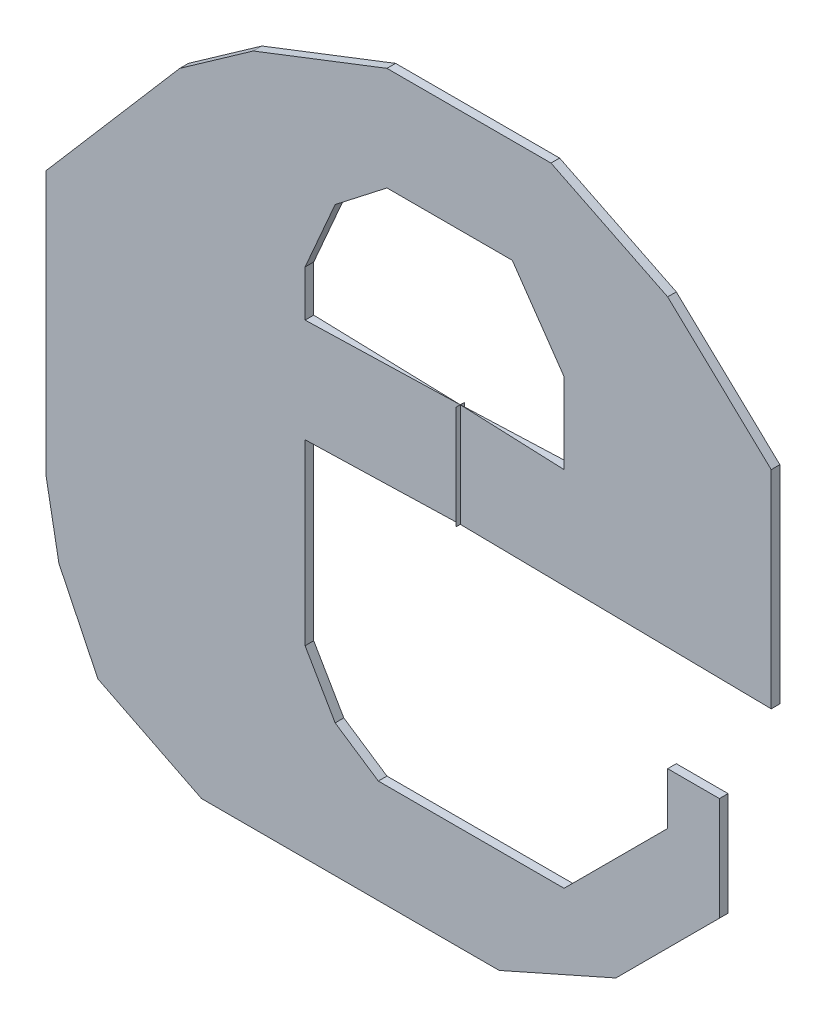
ISO-10303-21;
HEADER;
FILE_DESCRIPTION(('STEP AP214'),'2;1');
FILE_NAME('part.step','',(''),(''),'','','');
FILE_SCHEMA(('AUTOMOTIVE_DESIGN { 1 0 10303 214 1 1 1 1 }'));
ENDSEC;
DATA;
#1=APPLICATION_CONTEXT('core data for automotive mechanical design processes');
#2=APPLICATION_PROTOCOL_DEFINITION('international standard','automotive_design',2000,#1);
#3=PRODUCT_CONTEXT('',#1,'mechanical');
#4=PRODUCT('Part','Part','',(#3));
#5=PRODUCT_RELATED_PRODUCT_CATEGORY('part','',(#4));
#6=PRODUCT_DEFINITION_FORMATION('','',#4);
#7=PRODUCT_DEFINITION_CONTEXT('part definition',#1,'design');
#8=PRODUCT_DEFINITION('design','',#6,#7);
#9=PRODUCT_DEFINITION_SHAPE('','',#8);
#10=(LENGTH_UNIT() NAMED_UNIT(*) SI_UNIT(.MILLI.,.METRE.));
#11=(NAMED_UNIT(*) PLANE_ANGLE_UNIT() SI_UNIT($,.RADIAN.));
#12=(NAMED_UNIT(*) SI_UNIT($,.STERADIAN.) SOLID_ANGLE_UNIT());
#13=UNCERTAINTY_MEASURE_WITH_UNIT(LENGTH_MEASURE(1.E-05),#10,'distance_accuracy_value','');
#14=(GEOMETRIC_REPRESENTATION_CONTEXT(3) GLOBAL_UNCERTAINTY_ASSIGNED_CONTEXT((#13)) GLOBAL_UNIT_ASSIGNED_CONTEXT((#10,
#11,#12)) REPRESENTATION_CONTEXT('',''));
#15=CARTESIAN_POINT('',(0.,0.,0.));
#16=DIRECTION('',(0.,0.,1.));
#17=DIRECTION('',(1.,0.,0.));
#18=AXIS2_PLACEMENT_3D('',#15,#16,#17);
#19=CARTESIAN_POINT('',(-0.41999916,0.1200023,0.));
#20=DIRECTION('',(0.,0.,1.));
#21=DIRECTION('',(1.,0.,0.));
#22=AXIS2_PLACEMENT_3D('',#19,#20,#21);
#23=PLANE('',#22);
#24=DIRECTION('',(-0.501971217666236,0.864884325580407,0.));
#25=VECTOR('',#24,1.);
#26=CARTESIAN_POINT('',(-0.11999976,-0.20665694,0.));
#27=LINE('',#26,#25);
#28=CARTESIAN_POINT('',(-0.0851763599999863,-0.266656820000001,0.));
#29=VERTEX_POINT('',#28);
#30=CARTESIAN_POINT('',(-0.11999976,-0.20665694,0.));
#31=VERTEX_POINT('',#30);
#32=EDGE_CURVE('P0_E342',#29,#31,#27,.T.);
#33=ORIENTED_EDGE('',*,*,#32,.F.);
#34=DIRECTION('',(-0.831978762703653,0.554807478689769,0.));
#35=VECTOR('',#34,1.);
#36=CARTESIAN_POINT('',(-0.08517635999999,-0.26665682,0.));
#37=LINE('',#36,#35);
#38=CARTESIAN_POINT('',(-0.0351764599999852,-0.299999399999995,0.));
#39=VERTEX_POINT('',#38);
#40=EDGE_CURVE('P0_E346',#39,#29,#37,.T.);
#41=ORIENTED_EDGE('',*,*,#40,.F.);
#42=DIRECTION('',(1.,0.,0.));
#43=VECTOR('',#42,1.);
#44=CARTESIAN_POINT('',(-0.03517646,-0.2999994,0.));
#45=LINE('',#44,#43);
#46=CARTESIAN_POINT('',(0.18000218,-0.2999994,0.));
#47=VERTEX_POINT('',#46);
#48=EDGE_CURVE('P0_E349',#47,#39,#45,.F.);
#49=ORIENTED_EDGE('',*,*,#48,.F.);
#50=DIRECTION('',(-0.707099297664448,-0.707114264629448,0.));
#51=VECTOR('',#50,1.);
#52=CARTESIAN_POINT('',(0.18000218,-0.2999994,0.));
#53=LINE('',#52,#51);
#54=CARTESIAN_POINT('',(0.300001940000003,-0.179997100000009,0.));
#55=VERTEX_POINT('',#54);
#56=EDGE_CURVE('P0_E352',#55,#47,#53,.T.);
#57=ORIENTED_EDGE('',*,*,#56,.F.);
#58=DIRECTION('',(0.,1.,0.));
#59=VECTOR('',#58,1.);
#60=CARTESIAN_POINT('',(0.30000194,-0.1799971,0.));
#61=LINE('',#60,#59);
#62=CARTESIAN_POINT('',(0.30000194,-0.11999722,0.));
#63=VERTEX_POINT('',#62);
#64=EDGE_CURVE('P0_E355',#63,#55,#61,.F.);
#65=ORIENTED_EDGE('',*,*,#64,.F.);
#66=DIRECTION('',(1.,0.,0.));
#67=VECTOR('',#66,1.);
#68=CARTESIAN_POINT('',(0.30000194,-0.11999722,0.));
#69=LINE('',#68,#67);
#70=CARTESIAN_POINT('',(0.36000182,-0.11999722,0.));
#71=VERTEX_POINT('',#70);
#72=EDGE_CURVE('P0_E358',#71,#63,#69,.F.);
#73=ORIENTED_EDGE('',*,*,#72,.F.);
#74=DIRECTION('',(0.,1.,0.));
#75=VECTOR('',#74,1.);
#76=CARTESIAN_POINT('',(0.36000182,-0.11999722,0.));
#77=LINE('',#76,#75);
#78=CARTESIAN_POINT('',(0.36000182,-0.23999952,0.));
#79=VERTEX_POINT('',#78);
#80=EDGE_CURVE('P0_E361',#79,#71,#77,.T.);
#81=ORIENTED_EDGE('',*,*,#80,.F.);
#82=DIRECTION('',(0.707106781186548,0.707106781186548,0.));
#83=VECTOR('',#82,1.);
#84=CARTESIAN_POINT('',(0.36000182,-0.23999952,0.));
#85=LINE('',#84,#83);
#86=CARTESIAN_POINT('',(0.24000206,-0.35999928,0.));
#87=VERTEX_POINT('',#86);
#88=EDGE_CURVE('P0_E364',#87,#79,#85,.T.);
#89=ORIENTED_EDGE('',*,*,#88,.F.);
#90=DIRECTION('',(0.914011154655173,0.405689054777077,0.));
#91=VECTOR('',#90,1.);
#92=CARTESIAN_POINT('',(0.24000206,-0.35999928,0.));
#93=LINE('',#92,#91);
#94=CARTESIAN_POINT('',(0.104823259999896,-0.419999159999967,0.));
#95=VERTEX_POINT('',#94);
#96=EDGE_CURVE('P0_E367',#95,#87,#93,.T.);
#97=ORIENTED_EDGE('',*,*,#96,.F.);
#98=DIRECTION('',(1.,0.,0.));
#99=VECTOR('',#98,1.);
#100=CARTESIAN_POINT('',(0.10482326,-0.41999916,0.));
#101=LINE('',#100,#99);
#102=CARTESIAN_POINT('',(-0.23999952,-0.41999916,0.));
#103=VERTEX_POINT('',#102);
#104=EDGE_CURVE('P0_E370',#103,#95,#101,.T.);
#105=ORIENTED_EDGE('',*,*,#104,.F.);
#106=DIRECTION('',(0.894427190999916,-0.447213595499958,0.));
#107=VECTOR('',#106,1.);
#108=CARTESIAN_POINT('',(-0.23999952,-0.41999916,0.));
#109=LINE('',#108,#107);
#110=CARTESIAN_POINT('',(-0.35999928,-0.35999928,0.));
#111=VERTEX_POINT('',#110);
#112=EDGE_CURVE('P0_E373',#111,#103,#109,.T.);
#113=ORIENTED_EDGE('',*,*,#112,.F.);
#114=DIRECTION('',(0.435664640225979,-0.900109060756956,0.));
#115=VECTOR('',#114,1.);
#116=CARTESIAN_POINT('',(-0.35999928,-0.35999928,0.));
#117=LINE('',#116,#115);
#118=CARTESIAN_POINT('',(-0.405178259999995,-0.266656819999897,0.));
#119=VERTEX_POINT('',#118);
#120=EDGE_CURVE('P0_E376',#119,#111,#117,.T.);
#121=ORIENTED_EDGE('',*,*,#120,.F.);
#122=DIRECTION('',(0.182161924222928,-0.98326854590361,0.));
#123=VECTOR('',#122,1.);
#124=CARTESIAN_POINT('',(-0.40517826,-0.26665682,0.));
#125=LINE('',#124,#123);
#126=CARTESIAN_POINT('',(-0.419999159999972,-0.18665697999984,0.));
#127=VERTEX_POINT('',#126);
#128=EDGE_CURVE('P0_E379',#127,#119,#125,.T.);
#129=ORIENTED_EDGE('',*,*,#128,.F.);
#130=DIRECTION('',(0.,1.,0.));
#131=VECTOR('',#130,1.);
#132=CARTESIAN_POINT('',(-0.41999916,-0.18665698,0.));
#133=LINE('',#132,#131);
#134=CARTESIAN_POINT('',(-0.41999916,0.1200023,0.));
#135=VERTEX_POINT('',#134);
#136=EDGE_CURVE('P0_E382',#135,#127,#133,.F.);
#137=ORIENTED_EDGE('',*,*,#136,.F.);
#138=DIRECTION('',(-0.652096091016935,-0.758136325524924,0.));
#139=VECTOR('',#138,1.);
#140=CARTESIAN_POINT('',(-0.41999916,0.1200023,0.));
#141=LINE('',#140,#139);
#142=CARTESIAN_POINT('',(-0.265176000000209,0.300001939999913,0.));
#143=VERTEX_POINT('',#142);
#144=EDGE_CURVE('P0_E385',#143,#135,#141,.T.);
#145=ORIENTED_EDGE('',*,*,#144,.F.);
#146=DIRECTION('',(-0.817530952932881,-0.575884659455916,0.));
#147=VECTOR('',#146,1.);
#148=CARTESIAN_POINT('',(-0.265176,0.30000194,0.));
#149=LINE('',#148,#147);
#150=CARTESIAN_POINT('',(-0.17999964000008,0.360001819999988,0.));
#151=VERTEX_POINT('',#150);
#152=EDGE_CURVE('P0_E388',#151,#143,#149,.T.);
#153=ORIENTED_EDGE('',*,*,#152,.F.);
#154=DIRECTION('',(-0.932429482055999,-0.361351990437,0.));
#155=VECTOR('',#154,1.);
#156=CARTESIAN_POINT('',(-0.17999964,0.36000182,0.));
#157=LINE('',#156,#155);
#158=CARTESIAN_POINT('',(-0.025176479999881,0.420001699999965,0.));
#159=VERTEX_POINT('',#158);
#160=EDGE_CURVE('P0_E391',#159,#151,#157,.T.);
#161=ORIENTED_EDGE('',*,*,#160,.F.);
#162=DIRECTION('',(1.,0.,0.));
#163=VECTOR('',#162,1.);
#164=CARTESIAN_POINT('',(-0.02517648,0.4200017,0.));
#165=LINE('',#164,#163);
#166=CARTESIAN_POINT('',(0.16482314,0.4200017,0.));
#167=VERTEX_POINT('',#166);
#168=EDGE_CURVE('P0_E394',#167,#159,#165,.F.);
#169=ORIENTED_EDGE('',*,*,#168,.F.);
#170=DIRECTION('',(-0.896887445128295,0.442258873027145,0.));
#171=VECTOR('',#170,1.);
#172=CARTESIAN_POINT('',(0.16482314,0.4200017,0.));
#173=LINE('',#172,#171);
#174=CARTESIAN_POINT('',(0.300001940000008,0.353344479999988,0.));
#175=VERTEX_POINT('',#174);
#176=EDGE_CURVE('P0_E397',#175,#167,#173,.T.);
#177=ORIENTED_EDGE('',*,*,#176,.F.);
#178=DIRECTION('',(-0.726984986847149,0.686653354247141,0.));
#179=VECTOR('',#178,1.);
#180=CARTESIAN_POINT('',(0.30000194,0.35334448,0.));
#181=LINE('',#180,#179);
#182=CARTESIAN_POINT('',(0.420001700000025,0.240002060000076,0.));
#183=VERTEX_POINT('',#182);
#184=EDGE_CURVE('P0_E400',#183,#175,#181,.T.);
#185=ORIENTED_EDGE('',*,*,#184,.F.);
#186=DIRECTION('',(0.,1.,0.));
#187=VECTOR('',#186,1.);
#188=CARTESIAN_POINT('',(0.4200017,0.24000206,0.));
#189=LINE('',#188,#187);
#190=CARTESIAN_POINT('',(0.4200017,2.54000001120933E-06,0.));
#191=VERTEX_POINT('',#190);
#192=EDGE_CURVE('P0_E403',#191,#183,#189,.T.);
#193=ORIENTED_EDGE('',*,*,#192,.F.);
#194=DIRECTION('',(1.,0.,0.));
#195=VECTOR('',#194,1.);
#196=CARTESIAN_POINT('',(0.4200017,2.540000011209E-06,0.));
#197=LINE('',#196,#195);
#198=CARTESIAN_POINT('',(0.05482336,2.54000001120922E-06,0.005));
#199=VERTEX_POINT('',#198);
#200=EDGE_CURVE('P0_E406',#199,#191,#197,.T.);
#201=ORIENTED_EDGE('',*,*,#200,.F.);
#202=DIRECTION('',(1.,0.,0.));
#203=VECTOR('',#202,1.);
#204=CARTESIAN_POINT('',(0.05482336,2.540000011209E-06,0.));
#205=LINE('',#204,#203);
#206=CARTESIAN_POINT('',(-0.11999976,2.540000011209E-06,0.));
#207=VERTEX_POINT('',#206);
#208=EDGE_CURVE('P0_E408',#207,#199,#205,.T.);
#209=ORIENTED_EDGE('',*,*,#208,.F.);
#210=DIRECTION('',(0.,1.,0.));
#211=VECTOR('',#210,1.);
#212=CARTESIAN_POINT('',(-0.11999976,2.540000011209E-06,0.));
#213=LINE('',#212,#211);
#214=EDGE_CURVE('P0_E337',#31,#207,#213,.T.);
#215=ORIENTED_EDGE('',*,*,#214,.F.);
#216=EDGE_LOOP('',(#33,#41,#49,#57,#65,#73,#81,#89,#97,#105,#113,#121,#129,#137,#145,#153,#161,
#169,#177,#185,#193,#201,#209,#215));
#217=FACE_BOUND('',#216,.T.);
#218=DIRECTION('',(0.,1.,0.));
#219=VECTOR('',#218,1.);
#220=CARTESIAN_POINT('',(0.18000218,0.1200023,0.));
#221=LINE('',#220,#219);
#222=CARTESIAN_POINT('',(0.18000218,0.21334476,0.));
#223=VERTEX_POINT('',#222);
#224=CARTESIAN_POINT('',(0.18000218,0.1200023,0.));
#225=VERTEX_POINT('',#224);
#226=EDGE_CURVE('P0_E420',#223,#225,#221,.F.);
#227=ORIENTED_EDGE('',*,*,#226,.F.);
#228=DIRECTION('',(0.569251330886754,-0.822163561758644,0.));
#229=VECTOR('',#228,1.);
#230=CARTESIAN_POINT('',(0.18000218,0.21334476,0.));
#231=LINE('',#230,#229);
#232=CARTESIAN_POINT('',(0.120002299999998,0.30000194,0.));
#233=VERTEX_POINT('',#232);
#234=EDGE_CURVE('P0_E423',#233,#223,#231,.T.);
#235=ORIENTED_EDGE('',*,*,#234,.F.);
#236=DIRECTION('',(1.,0.,0.));
#237=VECTOR('',#236,1.);
#238=CARTESIAN_POINT('',(0.1200023,0.30000194,0.));
#239=LINE('',#238,#237);
#240=CARTESIAN_POINT('',(-0.02517648,0.30000194,0.));
#241=VERTEX_POINT('',#240);
#242=EDGE_CURVE('P0_E426',#241,#233,#239,.T.);
#243=ORIENTED_EDGE('',*,*,#242,.F.);
#244=DIRECTION('',(0.789411595772132,0.613864262244103,0.));
#245=VECTOR('',#244,1.);
#246=CARTESIAN_POINT('',(-0.02517648,0.30000194,0.));
#247=LINE('',#246,#245);
#248=CARTESIAN_POINT('',(-0.0851763599999871,0.253344680000036,0.));
#249=VERTEX_POINT('',#248);
#250=EDGE_CURVE('P0_E429',#249,#241,#247,.T.);
#251=ORIENTED_EDGE('',*,*,#250,.F.);
#252=DIRECTION('',(0.399119937367828,0.916898727011605,0.));
#253=VECTOR('',#252,1.);
#254=CARTESIAN_POINT('',(-0.08517635999999,0.25334468,0.));
#255=LINE('',#254,#253);
#256=CARTESIAN_POINT('',(-0.119999760000005,0.173344840000016,0.));
#257=VERTEX_POINT('',#256);
#258=EDGE_CURVE('P0_E233',#257,#249,#255,.T.);
#259=ORIENTED_EDGE('',*,*,#258,.F.);
#260=DIRECTION('',(0.,1.,0.));
#261=VECTOR('',#260,1.);
#262=CARTESIAN_POINT('',(-0.11999976,0.17334484,0.));
#263=LINE('',#262,#261);
#264=CARTESIAN_POINT('',(-0.11999976,0.1200023,0.));
#265=VERTEX_POINT('',#264);
#266=EDGE_CURVE('P0_E215',#265,#257,#263,.T.);
#267=ORIENTED_EDGE('',*,*,#266,.F.);
#268=DIRECTION('',(1.,0.,0.));
#269=VECTOR('',#268,1.);
#270=CARTESIAN_POINT('',(-0.11999976,0.1200023,0.));
#271=LINE('',#270,#269);
#272=CARTESIAN_POINT('',(0.05482336,0.1200023,0.005));
#273=VERTEX_POINT('',#272);
#274=EDGE_CURVE('P0_E221',#273,#265,#271,.F.);
#275=ORIENTED_EDGE('',*,*,#274,.F.);
#276=DIRECTION('',(1.,0.,0.));
#277=VECTOR('',#276,1.);
#278=CARTESIAN_POINT('',(0.05482336,0.1200023,0.));
#279=LINE('',#278,#277);
#280=EDGE_CURVE('P0_E413',#225,#273,#279,.F.);
#281=ORIENTED_EDGE('',*,*,#280,.F.);
#282=EDGE_LOOP('',(#227,#235,#243,#251,#259,#267,#275,#281));
#283=FACE_BOUND('',#282,.T.);
#284=ADVANCED_FACE('P0_F17',(#217,#283),#23,.F.);
#285=CARTESIAN_POINT('',(-0.11999976,0.1200023,0.));
#286=DIRECTION('',(0.,1.,0.));
#287=DIRECTION('',(0.,0.,1.));
#288=AXIS2_PLACEMENT_3D('',#285,#286,#287);
#289=PLANE('',#288);
#290=DIRECTION('',(1.,0.,0.));
#291=VECTOR('',#290,1.);
#292=CARTESIAN_POINT('',(-0.41999916,0.1200023,0.01));
#293=LINE('',#292,#291);
#294=CARTESIAN_POINT('',(-0.11999976,0.1200023,0.01));
#295=VERTEX_POINT('',#294);
#296=EDGE_CURVE('P0_E226',#273,#295,#293,.F.);
#297=ORIENTED_EDGE('',*,*,#296,.F.);
#298=ORIENTED_EDGE('',*,*,#274,.T.);
#299=DIRECTION('',(0.,0.,-1.));
#300=VECTOR('',#299,1.);
#301=CARTESIAN_POINT('',(-0.11999976,0.1200023,0.));
#302=LINE('',#301,#300);
#303=EDGE_CURVE('P0_E223',#295,#265,#302,.T.);
#304=ORIENTED_EDGE('',*,*,#303,.F.);
#305=EDGE_LOOP('',(#297,#298,#304));
#306=FACE_BOUND('',#305,.T.);
#307=ADVANCED_FACE('P0_F222',(#306),#289,.T.);
#308=CARTESIAN_POINT('',(-0.11999976,0.17334484,0.));
#309=DIRECTION('',(1.,0.,0.));
#310=DIRECTION('',(0.,0.,-1.));
#311=AXIS2_PLACEMENT_3D('',#308,#309,#310);
#312=PLANE('',#311);
#313=ORIENTED_EDGE('',*,*,#303,.T.);
#314=ORIENTED_EDGE('',*,*,#266,.T.);
#315=DIRECTION('',(0.,0.,1.));
#316=VECTOR('',#315,1.);
#317=CARTESIAN_POINT('',(-0.11999976000001,0.173344840000004,0.));
#318=LINE('',#317,#316);
#319=CARTESIAN_POINT('',(-0.119999760000003,0.173344840000002,0.01));
#320=VERTEX_POINT('',#319);
#321=EDGE_CURVE('P0_E235',#320,#257,#318,.F.);
#322=ORIENTED_EDGE('',*,*,#321,.F.);
#323=DIRECTION('',(0.,1.,0.));
#324=VECTOR('',#323,1.);
#325=CARTESIAN_POINT('',(-0.11999976,0.1200023,0.01));
#326=LINE('',#325,#324);
#327=EDGE_CURVE('P0_E239',#295,#320,#326,.T.);
#328=ORIENTED_EDGE('',*,*,#327,.F.);
#329=EDGE_LOOP('',(#313,#314,#322,#328));
#330=FACE_BOUND('',#329,.T.);
#331=ADVANCED_FACE('P0_F237',(#330),#312,.T.);
#332=CARTESIAN_POINT('',(-0.08517635999999,0.25334468,0.));
#333=DIRECTION('',(0.916898727011605,-0.399119937367828,0.));
#334=DIRECTION('',(0.399119937367828,0.916898727011605,0.));
#335=AXIS2_PLACEMENT_3D('',#332,#333,#334);
#336=PLANE('',#335);
#337=ORIENTED_EDGE('',*,*,#321,.T.);
#338=ORIENTED_EDGE('',*,*,#258,.T.);
#339=DIRECTION('',(0.,0.,1.));
#340=VECTOR('',#339,1.);
#341=CARTESIAN_POINT('',(-0.0851763600000064,0.253344680000021,0.));
#342=LINE('',#341,#340);
#343=CARTESIAN_POINT('',(-0.0851763599999929,0.253344680000008,0.01));
#344=VERTEX_POINT('',#343);
#345=EDGE_CURVE('P0_E431',#344,#249,#342,.F.);
#346=ORIENTED_EDGE('',*,*,#345,.F.);
#347=DIRECTION('',(0.39911993736771,0.916898727011656,0.));
#348=VECTOR('',#347,1.);
#349=CARTESIAN_POINT('',(-0.11999976,0.17334484,0.01));
#350=LINE('',#349,#348);
#351=EDGE_CURVE('P0_E332',#320,#344,#350,.T.);
#352=ORIENTED_EDGE('',*,*,#351,.F.);
#353=EDGE_LOOP('',(#337,#338,#346,#352));
#354=FACE_BOUND('',#353,.T.);
#355=ADVANCED_FACE('P0_F435',(#354),#336,.T.);
#356=CARTESIAN_POINT('',(-0.02517648,0.30000194,0.));
#357=DIRECTION('',(0.613864262244103,-0.789411595772132,0.));
#358=DIRECTION('',(0.789411595772132,0.613864262244103,0.));
#359=AXIS2_PLACEMENT_3D('',#356,#357,#358);
#360=PLANE('',#359);
#361=ORIENTED_EDGE('',*,*,#345,.T.);
#362=ORIENTED_EDGE('',*,*,#250,.T.);
#363=DIRECTION('',(0.,0.,-1.));
#364=VECTOR('',#363,1.);
#365=CARTESIAN_POINT('',(-0.02517648,0.30000194,0.));
#366=LINE('',#365,#364);
#367=CARTESIAN_POINT('',(-0.02517648,0.30000194,0.01));
#368=VERTEX_POINT('',#367);
#369=EDGE_CURVE('P0_E428',#368,#241,#366,.T.);
#370=ORIENTED_EDGE('',*,*,#369,.F.);
#371=DIRECTION('',(0.789411595771916,0.61386426224438,0.));
#372=VECTOR('',#371,1.);
#373=CARTESIAN_POINT('',(-0.08517635999999,0.25334468,0.01));
#374=LINE('',#373,#372);
#375=EDGE_CURVE('P0_E329',#344,#368,#374,.T.);
#376=ORIENTED_EDGE('',*,*,#375,.F.);
#377=EDGE_LOOP('',(#361,#362,#370,#376));
#378=FACE_BOUND('',#377,.T.);
#379=ADVANCED_FACE('P0_F462',(#378),#360,.T.);
#380=CARTESIAN_POINT('',(0.1200023,0.30000194,0.));
#381=DIRECTION('',(0.,-1.,0.));
#382=DIRECTION('',(0.,0.,-1.));
#383=AXIS2_PLACEMENT_3D('',#380,#381,#382);
#384=PLANE('',#383);
#385=ORIENTED_EDGE('',*,*,#369,.T.);
#386=ORIENTED_EDGE('',*,*,#242,.T.);
#387=DIRECTION('',(0.,0.,1.));
#388=VECTOR('',#387,1.);
#389=CARTESIAN_POINT('',(0.120002299999999,0.300001939999999,0.));
#390=LINE('',#389,#388);
#391=CARTESIAN_POINT('',(0.120002299999999,0.30000194,0.01));
#392=VERTEX_POINT('',#391);
#393=EDGE_CURVE('P0_E425',#392,#233,#390,.F.);
#394=ORIENTED_EDGE('',*,*,#393,.F.);
#395=DIRECTION('',(1.,0.,0.));
#396=VECTOR('',#395,1.);
#397=CARTESIAN_POINT('',(-0.41999916,0.30000194,0.01));
#398=LINE('',#397,#396);
#399=EDGE_CURVE('P0_E326',#368,#392,#398,.T.);
#400=ORIENTED_EDGE('',*,*,#399,.F.);
#401=EDGE_LOOP('',(#385,#386,#394,#400));
#402=FACE_BOUND('',#401,.T.);
#403=ADVANCED_FACE('P0_F460',(#402),#384,.T.);
#404=CARTESIAN_POINT('',(0.18000218,0.21334476,0.));
#405=DIRECTION('',(-0.822163561758644,-0.569251330886754,0.));
#406=DIRECTION('',(0.569251330886754,-0.822163561758644,0.));
#407=AXIS2_PLACEMENT_3D('',#404,#405,#406);
#408=PLANE('',#407);
#409=ORIENTED_EDGE('',*,*,#393,.T.);
#410=ORIENTED_EDGE('',*,*,#234,.T.);
#411=DIRECTION('',(0.,0.,1.));
#412=VECTOR('',#411,1.);
#413=CARTESIAN_POINT('',(0.18000218,0.21334476,0.));
#414=LINE('',#413,#412);
#415=CARTESIAN_POINT('',(0.18000218,0.21334476,0.01));
#416=VERTEX_POINT('',#415);
#417=EDGE_CURVE('P0_E422',#416,#223,#414,.F.);
#418=ORIENTED_EDGE('',*,*,#417,.F.);
#419=DIRECTION('',(0.56925133088674,-0.822163561758654,0.));
#420=VECTOR('',#419,1.);
#421=CARTESIAN_POINT('',(0.1200023,0.30000194,0.01));
#422=LINE('',#421,#420);
#423=EDGE_CURVE('P0_E323',#392,#416,#422,.T.);
#424=ORIENTED_EDGE('',*,*,#423,.F.);
#425=EDGE_LOOP('',(#409,#410,#418,#424));
#426=FACE_BOUND('',#425,.T.);
#427=ADVANCED_FACE('P0_F463',(#426),#408,.T.);
#428=CARTESIAN_POINT('',(0.18000218,0.1200023,0.));
#429=DIRECTION('',(-1.,0.,0.));
#430=DIRECTION('',(0.,0.,1.));
#431=AXIS2_PLACEMENT_3D('',#428,#429,#430);
#432=PLANE('',#431);
#433=ORIENTED_EDGE('',*,*,#417,.T.);
#434=ORIENTED_EDGE('',*,*,#226,.T.);
#435=DIRECTION('',(0.,0.,1.));
#436=VECTOR('',#435,1.);
#437=CARTESIAN_POINT('',(0.18000218,0.1200023,0.));
#438=LINE('',#437,#436);
#439=CARTESIAN_POINT('',(0.18000218,0.1200023,0.01));
#440=VERTEX_POINT('',#439);
#441=EDGE_CURVE('P0_E417',#440,#225,#438,.F.);
#442=ORIENTED_EDGE('',*,*,#441,.F.);
#443=DIRECTION('',(0.,1.,0.));
#444=VECTOR('',#443,1.);
#445=CARTESIAN_POINT('',(0.18000218,0.1200023,0.01));
#446=LINE('',#445,#444);
#447=EDGE_CURVE('P0_E318',#416,#440,#446,.F.);
#448=ORIENTED_EDGE('',*,*,#447,.F.);
#449=EDGE_LOOP('',(#433,#434,#442,#448));
#450=FACE_BOUND('',#449,.T.);
#451=ADVANCED_FACE('P0_F449',(#450),#432,.T.);
#452=CARTESIAN_POINT('',(0.05482336,0.1200023,0.));
#453=DIRECTION('',(0.,1.,0.));
#454=DIRECTION('',(0.,0.,1.));
#455=AXIS2_PLACEMENT_3D('',#452,#453,#454);
#456=PLANE('',#455);
#457=ORIENTED_EDGE('',*,*,#441,.T.);
#458=ORIENTED_EDGE('',*,*,#280,.T.);
#459=DIRECTION('',(1.,0.,0.));
#460=VECTOR('',#459,1.);
#461=CARTESIAN_POINT('',(-0.41999916,0.1200023,0.01));
#462=LINE('',#461,#460);
#463=EDGE_CURVE('P0_E314',#440,#273,#462,.F.);
#464=ORIENTED_EDGE('',*,*,#463,.F.);
#465=EDGE_LOOP('',(#457,#458,#464));
#466=FACE_BOUND('',#465,.T.);
#467=ADVANCED_FACE('P0_F443',(#466),#456,.T.);
#468=CARTESIAN_POINT('',(0.05482336,2.540000011209E-06,0.));
#469=DIRECTION('',(0.,-1.,0.));
#470=DIRECTION('',(0.,0.,-1.));
#471=AXIS2_PLACEMENT_3D('',#468,#469,#470);
#472=PLANE('',#471);
#473=DIRECTION('',(0.,0.,-1.));
#474=VECTOR('',#473,1.);
#475=CARTESIAN_POINT('',(-0.11999976,2.540000011209E-06,0.));
#476=LINE('',#475,#474);
#477=CARTESIAN_POINT('',(-0.11999976,2.54000001120933E-06,0.01));
#478=VERTEX_POINT('',#477);
#479=EDGE_CURVE('P0_E344',#207,#478,#476,.F.);
#480=ORIENTED_EDGE('',*,*,#479,.F.);
#481=ORIENTED_EDGE('',*,*,#208,.T.);
#482=DIRECTION('',(1.,0.,0.));
#483=VECTOR('',#482,1.);
#484=CARTESIAN_POINT('',(-0.41999916,2.54000001120944E-06,0.01));
#485=LINE('',#484,#483);
#486=EDGE_CURVE('P0_E309',#478,#199,#485,.T.);
#487=ORIENTED_EDGE('',*,*,#486,.F.);
#488=EDGE_LOOP('',(#480,#481,#487));
#489=FACE_BOUND('',#488,.T.);
#490=ADVANCED_FACE('P0_F569',(#489),#472,.T.);
#491=CARTESIAN_POINT('',(0.4200017,2.540000011209E-06,0.));
#492=DIRECTION('',(0.,-1.,0.));
#493=DIRECTION('',(0.,0.,-1.));
#494=AXIS2_PLACEMENT_3D('',#491,#492,#493);
#495=PLANE('',#494);
#496=DIRECTION('',(1.,0.,0.));
#497=VECTOR('',#496,1.);
#498=CARTESIAN_POINT('',(-0.41999916,2.54000001120944E-06,0.01));
#499=LINE('',#498,#497);
#500=CARTESIAN_POINT('',(0.4200017,2.54000001120944E-06,0.01));
#501=VERTEX_POINT('',#500);
#502=EDGE_CURVE('P0_E306',#199,#501,#499,.T.);
#503=ORIENTED_EDGE('',*,*,#502,.F.);
#504=ORIENTED_EDGE('',*,*,#200,.T.);
#505=DIRECTION('',(0.,0.,-1.));
#506=VECTOR('',#505,1.);
#507=CARTESIAN_POINT('',(0.4200017,2.54000001120944E-06,0.));
#508=LINE('',#507,#506);
#509=EDGE_CURVE('P0_E405',#501,#191,#508,.T.);
#510=ORIENTED_EDGE('',*,*,#509,.F.);
#511=EDGE_LOOP('',(#503,#504,#510));
#512=FACE_BOUND('',#511,.T.);
#513=ADVANCED_FACE('P0_F565',(#512),#495,.T.);
#514=CARTESIAN_POINT('',(0.4200017,0.24000206,0.));
#515=DIRECTION('',(1.,0.,0.));
#516=DIRECTION('',(0.,0.,-1.));
#517=AXIS2_PLACEMENT_3D('',#514,#515,#516);
#518=PLANE('',#517);
#519=ORIENTED_EDGE('',*,*,#509,.T.);
#520=ORIENTED_EDGE('',*,*,#192,.T.);
#521=DIRECTION('',(0.,0.,1.));
#522=VECTOR('',#521,1.);
#523=CARTESIAN_POINT('',(0.42000170000005,0.240002060000052,0.));
#524=LINE('',#523,#522);
#525=CARTESIAN_POINT('',(0.420001700000012,0.240002060000026,0.01));
#526=VERTEX_POINT('',#525);
#527=EDGE_CURVE('P0_E402',#526,#183,#524,.F.);
#528=ORIENTED_EDGE('',*,*,#527,.F.);
#529=DIRECTION('',(0.,1.,0.));
#530=VECTOR('',#529,1.);
#531=CARTESIAN_POINT('',(0.4200017,0.1200023,0.01));
#532=LINE('',#531,#530);
#533=EDGE_CURVE('P0_E303',#501,#526,#532,.T.);
#534=ORIENTED_EDGE('',*,*,#533,.F.);
#535=EDGE_LOOP('',(#519,#520,#528,#534));
#536=FACE_BOUND('',#535,.T.);
#537=ADVANCED_FACE('P0_F561',(#536),#518,.T.);
#538=CARTESIAN_POINT('',(0.30000194,0.35334448,0.));
#539=DIRECTION('',(0.686653354247141,0.726984986847149,0.));
#540=DIRECTION('',(-0.726984986847149,0.686653354247141,0.));
#541=AXIS2_PLACEMENT_3D('',#538,#539,#540);
#542=PLANE('',#541);
#543=ORIENTED_EDGE('',*,*,#527,.T.);
#544=ORIENTED_EDGE('',*,*,#184,.T.);
#545=DIRECTION('',(0.,0.,1.));
#546=VECTOR('',#545,1.);
#547=CARTESIAN_POINT('',(0.300001939999997,0.353344479999994,0.));
#548=LINE('',#547,#546);
#549=CARTESIAN_POINT('',(0.30000194,0.353344479999998,0.01));
#550=VERTEX_POINT('',#549);
#551=EDGE_CURVE('P0_E399',#550,#175,#548,.F.);
#552=ORIENTED_EDGE('',*,*,#551,.F.);
#553=DIRECTION('',(-0.726984986846849,0.686653354247459,0.));
#554=VECTOR('',#553,1.);
#555=CARTESIAN_POINT('',(0.4200017,0.24000206,0.01));
#556=LINE('',#555,#554);
#557=EDGE_CURVE('P0_E300',#526,#550,#556,.T.);
#558=ORIENTED_EDGE('',*,*,#557,.F.);
#559=EDGE_LOOP('',(#543,#544,#552,#558));
#560=FACE_BOUND('',#559,.T.);
#561=ADVANCED_FACE('P0_F557',(#560),#542,.T.);
#562=CARTESIAN_POINT('',(0.16482314,0.4200017,0.));
#563=DIRECTION('',(0.442258873027145,0.896887445128295,0.));
#564=DIRECTION('',(-0.896887445128295,0.442258873027145,0.));
#565=AXIS2_PLACEMENT_3D('',#562,#563,#564);
#566=PLANE('',#565);
#567=ORIENTED_EDGE('',*,*,#551,.T.);
#568=ORIENTED_EDGE('',*,*,#176,.T.);
#569=DIRECTION('',(0.,0.,1.));
#570=VECTOR('',#569,1.);
#571=CARTESIAN_POINT('',(0.16482314,0.4200017,0.));
#572=LINE('',#571,#570);
#573=CARTESIAN_POINT('',(0.16482314,0.4200017,0.01));
#574=VERTEX_POINT('',#573);
#575=EDGE_CURVE('P0_E396',#574,#167,#572,.F.);
#576=ORIENTED_EDGE('',*,*,#575,.F.);
#577=DIRECTION('',(-0.896887445128316,0.442258873027102,0.));
#578=VECTOR('',#577,1.);
#579=CARTESIAN_POINT('',(0.30000194,0.35334448,0.01));
#580=LINE('',#579,#578);
#581=EDGE_CURVE('P0_E297',#550,#574,#580,.T.);
#582=ORIENTED_EDGE('',*,*,#581,.F.);
#583=EDGE_LOOP('',(#567,#568,#576,#582));
#584=FACE_BOUND('',#583,.T.);
#585=ADVANCED_FACE('P0_F553',(#584),#566,.T.);
#586=CARTESIAN_POINT('',(-0.02517648,0.4200017,0.));
#587=DIRECTION('',(0.,1.,0.));
#588=DIRECTION('',(0.,0.,1.));
#589=AXIS2_PLACEMENT_3D('',#586,#587,#588);
#590=PLANE('',#589);
#591=ORIENTED_EDGE('',*,*,#575,.T.);
#592=ORIENTED_EDGE('',*,*,#168,.T.);
#593=DIRECTION('',(0.,0.,1.));
#594=VECTOR('',#593,1.);
#595=CARTESIAN_POINT('',(-0.0251764799999725,0.420001699999929,0.));
#596=LINE('',#595,#594);
#597=CARTESIAN_POINT('',(-0.0251764799999863,0.420001699999982,0.01));
#598=VERTEX_POINT('',#597);
#599=EDGE_CURVE('P0_E393',#598,#159,#596,.F.);
#600=ORIENTED_EDGE('',*,*,#599,.F.);
#601=DIRECTION('',(1.,0.,0.));
#602=VECTOR('',#601,1.);
#603=CARTESIAN_POINT('',(-0.41999916,0.4200017,0.01));
#604=LINE('',#603,#602);
#605=EDGE_CURVE('P0_E294',#574,#598,#604,.F.);
#606=ORIENTED_EDGE('',*,*,#605,.F.);
#607=EDGE_LOOP('',(#591,#592,#600,#606));
#608=FACE_BOUND('',#607,.T.);
#609=ADVANCED_FACE('P0_F549',(#608),#590,.T.);
#610=CARTESIAN_POINT('',(-0.17999964,0.36000182,0.));
#611=DIRECTION('',(-0.361351990437,0.932429482055999,0.));
#612=DIRECTION('',(-0.932429482055999,-0.361351990437,0.));
#613=AXIS2_PLACEMENT_3D('',#610,#611,#612);
#614=PLANE('',#613);
#615=ORIENTED_EDGE('',*,*,#599,.T.);
#616=ORIENTED_EDGE('',*,*,#160,.T.);
#617=DIRECTION('',(0.,0.,1.));
#618=VECTOR('',#617,1.);
#619=CARTESIAN_POINT('',(-0.179999640000021,0.360001820000029,0.));
#620=LINE('',#619,#618);
#621=CARTESIAN_POINT('',(-0.179999640000007,0.360001820000006,0.01));
#622=VERTEX_POINT('',#621);
#623=EDGE_CURVE('P0_E390',#622,#151,#620,.F.);
#624=ORIENTED_EDGE('',*,*,#623,.F.);
#625=DIRECTION('',(-0.932429482055834,-0.361351990437427,0.));
#626=VECTOR('',#625,1.);
#627=CARTESIAN_POINT('',(-0.02517648,0.4200017,0.01));
#628=LINE('',#627,#626);
#629=EDGE_CURVE('P0_E291',#598,#622,#628,.T.);
#630=ORIENTED_EDGE('',*,*,#629,.F.);
#631=EDGE_LOOP('',(#615,#616,#624,#630));
#632=FACE_BOUND('',#631,.T.);
#633=ADVANCED_FACE('P0_F545',(#632),#614,.T.);
#634=CARTESIAN_POINT('',(-0.265176,0.30000194,0.));
#635=DIRECTION('',(-0.575884659455916,0.817530952932881,0.));
#636=DIRECTION('',(-0.817530952932881,-0.575884659455916,0.));
#637=AXIS2_PLACEMENT_3D('',#634,#635,#636);
#638=PLANE('',#637);
#639=ORIENTED_EDGE('',*,*,#623,.T.);
#640=ORIENTED_EDGE('',*,*,#152,.T.);
#641=DIRECTION('',(0.,0.,1.));
#642=VECTOR('',#641,1.);
#643=CARTESIAN_POINT('',(-0.265176000000077,0.300001940000066,0.));
#644=LINE('',#643,#642);
#645=CARTESIAN_POINT('',(-0.265176000000024,0.300001940000013,0.01));
#646=VERTEX_POINT('',#645);
#647=EDGE_CURVE('P0_E387',#646,#143,#644,.F.);
#648=ORIENTED_EDGE('',*,*,#647,.F.);
#649=DIRECTION('',(-0.81753095293308,-0.575884659455632,0.));
#650=VECTOR('',#649,1.);
#651=CARTESIAN_POINT('',(-0.17999964,0.36000182,0.01));
#652=LINE('',#651,#650);
#653=EDGE_CURVE('P0_E288',#622,#646,#652,.T.);
#654=ORIENTED_EDGE('',*,*,#653,.F.);
#655=EDGE_LOOP('',(#639,#640,#648,#654));
#656=FACE_BOUND('',#655,.T.);
#657=ADVANCED_FACE('P0_F541',(#656),#638,.T.);
#658=CARTESIAN_POINT('',(-0.41999916,0.1200023,0.));
#659=DIRECTION('',(-0.758136325524924,0.652096091016935,0.));
#660=DIRECTION('',(-0.652096091016935,-0.758136325524924,0.));
#661=AXIS2_PLACEMENT_3D('',#658,#659,#660);
#662=PLANE('',#661);
#663=ORIENTED_EDGE('',*,*,#647,.T.);
#664=ORIENTED_EDGE('',*,*,#144,.T.);
#665=DIRECTION('',(0.,0.,1.));
#666=VECTOR('',#665,1.);
#667=CARTESIAN_POINT('',(-0.41999916,0.1200023,0.));
#668=LINE('',#667,#666);
#669=CARTESIAN_POINT('',(-0.41999916,0.1200023,0.01));
#670=VERTEX_POINT('',#669);
#671=EDGE_CURVE('P0_E384',#670,#135,#668,.F.);
#672=ORIENTED_EDGE('',*,*,#671,.F.);
#673=DIRECTION('',(-0.65209609101726,-0.758136325524644,0.));
#674=VECTOR('',#673,1.);
#675=CARTESIAN_POINT('',(-0.265176,0.30000194,0.01));
#676=LINE('',#675,#674);
#677=EDGE_CURVE('P0_E285',#646,#670,#676,.T.);
#678=ORIENTED_EDGE('',*,*,#677,.F.);
#679=EDGE_LOOP('',(#663,#664,#672,#678));
#680=FACE_BOUND('',#679,.T.);
#681=ADVANCED_FACE('P0_F537',(#680),#662,.T.);
#682=CARTESIAN_POINT('',(-0.41999916,-0.18665698,0.));
#683=DIRECTION('',(-1.,0.,0.));
#684=DIRECTION('',(0.,0.,1.));
#685=AXIS2_PLACEMENT_3D('',#682,#683,#684);
#686=PLANE('',#685);
#687=ORIENTED_EDGE('',*,*,#671,.T.);
#688=ORIENTED_EDGE('',*,*,#136,.T.);
#689=DIRECTION('',(0.,0.,1.));
#690=VECTOR('',#689,1.);
#691=CARTESIAN_POINT('',(-0.419999159999945,-0.18665697999999,0.));
#692=LINE('',#691,#690);
#693=CARTESIAN_POINT('',(-0.419999159999986,-0.186656979999995,0.01));
#694=VERTEX_POINT('',#693);
#695=EDGE_CURVE('P0_E381',#694,#127,#692,.F.);
#696=ORIENTED_EDGE('',*,*,#695,.F.);
#697=DIRECTION('',(0.,1.,0.));
#698=VECTOR('',#697,1.);
#699=CARTESIAN_POINT('',(-0.41999916,0.1200023,0.01));
#700=LINE('',#699,#698);
#701=EDGE_CURVE('P0_E282',#670,#694,#700,.F.);
#702=ORIENTED_EDGE('',*,*,#701,.F.);
#703=EDGE_LOOP('',(#687,#688,#696,#702));
#704=FACE_BOUND('',#703,.T.);
#705=ADVANCED_FACE('P0_F533',(#704),#686,.T.);
#706=CARTESIAN_POINT('',(-0.40517826,-0.26665682,0.));
#707=DIRECTION('',(-0.98326854590361,-0.182161924222928,0.));
#708=DIRECTION('',(0.182161924222928,-0.98326854590361,0.));
#709=AXIS2_PLACEMENT_3D('',#706,#707,#708);
#710=PLANE('',#709);
#711=ORIENTED_EDGE('',*,*,#695,.T.);
#712=ORIENTED_EDGE('',*,*,#128,.T.);
#713=DIRECTION('',(0.,0.,1.));
#714=VECTOR('',#713,1.);
#715=CARTESIAN_POINT('',(-0.405178259999955,-0.266656819999978,0.));
#716=LINE('',#715,#714);
#717=CARTESIAN_POINT('',(-0.405178259999989,-0.266656819999991,0.01));
#718=VERTEX_POINT('',#717);
#719=EDGE_CURVE('P0_E378',#718,#119,#716,.F.);
#720=ORIENTED_EDGE('',*,*,#719,.F.);
#721=DIRECTION('',(0.18216192422361,-0.983268545903484,0.));
#722=VECTOR('',#721,1.);
#723=CARTESIAN_POINT('',(-0.41999916,-0.18665698,0.01));
#724=LINE('',#723,#722);
#725=EDGE_CURVE('P0_E279',#694,#718,#724,.T.);
#726=ORIENTED_EDGE('',*,*,#725,.F.);
#727=EDGE_LOOP('',(#711,#712,#720,#726));
#728=FACE_BOUND('',#727,.T.);
#729=ADVANCED_FACE('P0_F529',(#728),#710,.T.);
#730=CARTESIAN_POINT('',(-0.35999928,-0.35999928,0.));
#731=DIRECTION('',(-0.900109060756956,-0.435664640225979,0.));
#732=DIRECTION('',(0.435664640225979,-0.900109060756956,0.));
#733=AXIS2_PLACEMENT_3D('',#730,#731,#732);
#734=PLANE('',#733);
#735=ORIENTED_EDGE('',*,*,#719,.T.);
#736=ORIENTED_EDGE('',*,*,#120,.T.);
#737=DIRECTION('',(0.,0.,1.));
#738=VECTOR('',#737,1.);
#739=CARTESIAN_POINT('',(-0.35999928,-0.35999928,0.));
#740=LINE('',#739,#738);
#741=CARTESIAN_POINT('',(-0.35999928,-0.35999928,0.01));
#742=VERTEX_POINT('',#741);
#743=EDGE_CURVE('P0_E375',#742,#111,#740,.F.);
#744=ORIENTED_EDGE('',*,*,#743,.F.);
#745=DIRECTION('',(0.435664640226408,-0.900109060756747,0.));
#746=VECTOR('',#745,1.);
#747=CARTESIAN_POINT('',(-0.40517826,-0.26665682,0.01));
#748=LINE('',#747,#746);
#749=EDGE_CURVE('P0_E276',#718,#742,#748,.T.);
#750=ORIENTED_EDGE('',*,*,#749,.F.);
#751=EDGE_LOOP('',(#735,#736,#744,#750));
#752=FACE_BOUND('',#751,.T.);
#753=ADVANCED_FACE('P0_F525',(#752),#734,.T.);
#754=CARTESIAN_POINT('',(-0.23999952,-0.41999916,0.));
#755=DIRECTION('',(-0.447213595499958,-0.894427190999916,0.));
#756=DIRECTION('',(0.894427190999916,-0.447213595499958,0.));
#757=AXIS2_PLACEMENT_3D('',#754,#755,#756);
#758=PLANE('',#757);
#759=ORIENTED_EDGE('',*,*,#743,.T.);
#760=ORIENTED_EDGE('',*,*,#112,.T.);
#761=DIRECTION('',(0.,0.,-1.));
#762=VECTOR('',#761,1.);
#763=CARTESIAN_POINT('',(-0.23999952,-0.41999916,0.));
#764=LINE('',#763,#762);
#765=CARTESIAN_POINT('',(-0.23999952,-0.41999916,0.01));
#766=VERTEX_POINT('',#765);
#767=EDGE_CURVE('P0_E372',#766,#103,#764,.T.);
#768=ORIENTED_EDGE('',*,*,#767,.F.);
#769=DIRECTION('',(0.894427190999916,-0.447213595499958,0.));
#770=VECTOR('',#769,1.);
#771=CARTESIAN_POINT('',(-0.35999928,-0.35999928,0.01));
#772=LINE('',#771,#770);
#773=EDGE_CURVE('P0_E273',#742,#766,#772,.T.);
#774=ORIENTED_EDGE('',*,*,#773,.F.);
#775=EDGE_LOOP('',(#759,#760,#768,#774));
#776=FACE_BOUND('',#775,.T.);
#777=ADVANCED_FACE('P0_F521',(#776),#758,.T.);
#778=CARTESIAN_POINT('',(0.10482326,-0.41999916,0.));
#779=DIRECTION('',(0.,-1.,0.));
#780=DIRECTION('',(0.,0.,-1.));
#781=AXIS2_PLACEMENT_3D('',#778,#779,#780);
#782=PLANE('',#781);
#783=ORIENTED_EDGE('',*,*,#767,.T.);
#784=ORIENTED_EDGE('',*,*,#104,.T.);
#785=DIRECTION('',(0.,0.,1.));
#786=VECTOR('',#785,1.);
#787=CARTESIAN_POINT('',(0.104823259999971,-0.419999159999934,0.));
#788=LINE('',#787,#786);
#789=CARTESIAN_POINT('',(0.104823259999985,-0.419999159999983,0.01));
#790=VERTEX_POINT('',#789);
#791=EDGE_CURVE('P0_E369',#790,#95,#788,.F.);
#792=ORIENTED_EDGE('',*,*,#791,.F.);
#793=DIRECTION('',(1.,0.,0.));
#794=VECTOR('',#793,1.);
#795=CARTESIAN_POINT('',(-0.41999916,-0.41999916,0.01));
#796=LINE('',#795,#794);
#797=EDGE_CURVE('P0_E270',#766,#790,#796,.T.);
#798=ORIENTED_EDGE('',*,*,#797,.F.);
#799=EDGE_LOOP('',(#783,#784,#792,#798));
#800=FACE_BOUND('',#799,.T.);
#801=ADVANCED_FACE('P0_F517',(#800),#782,.T.);
#802=CARTESIAN_POINT('',(0.24000206,-0.35999928,0.));
#803=DIRECTION('',(0.405689054777077,-0.914011154655173,0.));
#804=DIRECTION('',(0.914011154655173,0.405689054777077,0.));
#805=AXIS2_PLACEMENT_3D('',#802,#803,#804);
#806=PLANE('',#805);
#807=ORIENTED_EDGE('',*,*,#791,.T.);
#808=ORIENTED_EDGE('',*,*,#96,.T.);
#809=DIRECTION('',(0.,0.,1.));
#810=VECTOR('',#809,1.);
#811=CARTESIAN_POINT('',(0.24000206,-0.35999928,0.));
#812=LINE('',#811,#810);
#813=CARTESIAN_POINT('',(0.24000206,-0.35999928,0.01));
#814=VERTEX_POINT('',#813);
#815=EDGE_CURVE('P0_E366',#814,#87,#812,.F.);
#816=ORIENTED_EDGE('',*,*,#815,.F.);
#817=DIRECTION('',(0.914011154654974,0.405689054777524,0.));
#818=VECTOR('',#817,1.);
#819=CARTESIAN_POINT('',(0.10482326,-0.41999916,0.01));
#820=LINE('',#819,#818);
#821=EDGE_CURVE('P0_E267',#790,#814,#820,.T.);
#822=ORIENTED_EDGE('',*,*,#821,.F.);
#823=EDGE_LOOP('',(#807,#808,#816,#822));
#824=FACE_BOUND('',#823,.T.);
#825=ADVANCED_FACE('P0_F513',(#824),#806,.T.);
#826=CARTESIAN_POINT('',(0.36000182,-0.23999952,0.));
#827=DIRECTION('',(0.707106781186548,-0.707106781186548,0.));
#828=DIRECTION('',(0.707106781186548,0.707106781186548,0.));
#829=AXIS2_PLACEMENT_3D('',#826,#827,#828);
#830=PLANE('',#829);
#831=ORIENTED_EDGE('',*,*,#815,.T.);
#832=ORIENTED_EDGE('',*,*,#88,.T.);
#833=DIRECTION('',(0.,0.,-1.));
#834=VECTOR('',#833,1.);
#835=CARTESIAN_POINT('',(0.36000182,-0.23999952,0.));
#836=LINE('',#835,#834);
#837=CARTESIAN_POINT('',(0.36000182,-0.23999952,0.01));
#838=VERTEX_POINT('',#837);
#839=EDGE_CURVE('P0_E363',#838,#79,#836,.T.);
#840=ORIENTED_EDGE('',*,*,#839,.F.);
#841=DIRECTION('',(0.707106781186547,0.707106781186547,0.));
#842=VECTOR('',#841,1.);
#843=CARTESIAN_POINT('',(0.24000206,-0.35999928,0.01));
#844=LINE('',#843,#842);
#845=EDGE_CURVE('P0_E264',#814,#838,#844,.T.);
#846=ORIENTED_EDGE('',*,*,#845,.F.);
#847=EDGE_LOOP('',(#831,#832,#840,#846));
#848=FACE_BOUND('',#847,.T.);
#849=ADVANCED_FACE('P0_F509',(#848),#830,.T.);
#850=CARTESIAN_POINT('',(0.36000182,-0.11999722,0.));
#851=DIRECTION('',(1.,0.,0.));
#852=DIRECTION('',(0.,0.,-1.));
#853=AXIS2_PLACEMENT_3D('',#850,#851,#852);
#854=PLANE('',#853);
#855=ORIENTED_EDGE('',*,*,#839,.T.);
#856=ORIENTED_EDGE('',*,*,#80,.T.);
#857=DIRECTION('',(0.,0.,1.));
#858=VECTOR('',#857,1.);
#859=CARTESIAN_POINT('',(0.36000182,-0.11999722,0.));
#860=LINE('',#859,#858);
#861=CARTESIAN_POINT('',(0.36000182,-0.11999722,0.01));
#862=VERTEX_POINT('',#861);
#863=EDGE_CURVE('P0_E360',#862,#71,#860,.F.);
#864=ORIENTED_EDGE('',*,*,#863,.F.);
#865=DIRECTION('',(0.,1.,0.));
#866=VECTOR('',#865,1.);
#867=CARTESIAN_POINT('',(0.36000182,0.1200023,0.01));
#868=LINE('',#867,#866);
#869=EDGE_CURVE('P0_E261',#838,#862,#868,.T.);
#870=ORIENTED_EDGE('',*,*,#869,.F.);
#871=EDGE_LOOP('',(#855,#856,#864,#870));
#872=FACE_BOUND('',#871,.T.);
#873=ADVANCED_FACE('P0_F505',(#872),#854,.T.);
#874=CARTESIAN_POINT('',(0.30000194,-0.11999722,0.));
#875=DIRECTION('',(0.,1.,0.));
#876=DIRECTION('',(0.,0.,1.));
#877=AXIS2_PLACEMENT_3D('',#874,#875,#876);
#878=PLANE('',#877);
#879=ORIENTED_EDGE('',*,*,#863,.T.);
#880=ORIENTED_EDGE('',*,*,#72,.T.);
#881=DIRECTION('',(0.,0.,1.));
#882=VECTOR('',#881,1.);
#883=CARTESIAN_POINT('',(0.30000194,-0.11999722,0.));
#884=LINE('',#883,#882);
#885=CARTESIAN_POINT('',(0.30000194,-0.11999722,0.01));
#886=VERTEX_POINT('',#885);
#887=EDGE_CURVE('P0_E357',#886,#63,#884,.F.);
#888=ORIENTED_EDGE('',*,*,#887,.F.);
#889=DIRECTION('',(1.,0.,0.));
#890=VECTOR('',#889,1.);
#891=CARTESIAN_POINT('',(-0.41999916,-0.11999722,0.01));
#892=LINE('',#891,#890);
#893=EDGE_CURVE('P0_E258',#862,#886,#892,.F.);
#894=ORIENTED_EDGE('',*,*,#893,.F.);
#895=EDGE_LOOP('',(#879,#880,#888,#894));
#896=FACE_BOUND('',#895,.T.);
#897=ADVANCED_FACE('P0_F501',(#896),#878,.T.);
#898=CARTESIAN_POINT('',(0.30000194,-0.1799971,0.));
#899=DIRECTION('',(-1.,0.,0.));
#900=DIRECTION('',(0.,0.,1.));
#901=AXIS2_PLACEMENT_3D('',#898,#899,#900);
#902=PLANE('',#901);
#903=ORIENTED_EDGE('',*,*,#887,.T.);
#904=ORIENTED_EDGE('',*,*,#64,.T.);
#905=DIRECTION('',(0.,0.,1.));
#906=VECTOR('',#905,1.);
#907=CARTESIAN_POINT('',(0.300001940000006,-0.179997100000006,0.));
#908=LINE('',#907,#906);
#909=CARTESIAN_POINT('',(0.300001940000001,-0.179997100000003,0.01));
#910=VERTEX_POINT('',#909);
#911=EDGE_CURVE('P0_E354',#910,#55,#908,.F.);
#912=ORIENTED_EDGE('',*,*,#911,.F.);
#913=DIRECTION('',(0.,1.,0.));
#914=VECTOR('',#913,1.);
#915=CARTESIAN_POINT('',(0.30000194,0.1200023,0.01));
#916=LINE('',#915,#914);
#917=EDGE_CURVE('P0_E255',#886,#910,#916,.F.);
#918=ORIENTED_EDGE('',*,*,#917,.F.);
#919=EDGE_LOOP('',(#903,#904,#912,#918));
#920=FACE_BOUND('',#919,.T.);
#921=ADVANCED_FACE('P0_F497',(#920),#902,.T.);
#922=CARTESIAN_POINT('',(0.18000218,-0.2999994,0.));
#923=DIRECTION('',(-0.707114264629448,0.707099297664448,0.));
#924=DIRECTION('',(-0.707099297664448,-0.707114264629448,0.));
#925=AXIS2_PLACEMENT_3D('',#922,#923,#924);
#926=PLANE('',#925);
#927=ORIENTED_EDGE('',*,*,#911,.T.);
#928=ORIENTED_EDGE('',*,*,#56,.T.);
#929=DIRECTION('',(0.,0.,1.));
#930=VECTOR('',#929,1.);
#931=CARTESIAN_POINT('',(0.18000218,-0.2999994,0.));
#932=LINE('',#931,#930);
#933=CARTESIAN_POINT('',(0.18000218,-0.2999994,0.01));
#934=VERTEX_POINT('',#933);
#935=EDGE_CURVE('P0_E351',#934,#47,#932,.F.);
#936=ORIENTED_EDGE('',*,*,#935,.F.);
#937=DIRECTION('',(-0.707099297664414,-0.707114264629481,0.));
#938=VECTOR('',#937,1.);
#939=CARTESIAN_POINT('',(0.30000194,-0.1799971,0.01));
#940=LINE('',#939,#938);
#941=EDGE_CURVE('P0_E252',#910,#934,#940,.T.);
#942=ORIENTED_EDGE('',*,*,#941,.F.);
#943=EDGE_LOOP('',(#927,#928,#936,#942));
#944=FACE_BOUND('',#943,.T.);
#945=ADVANCED_FACE('P0_F493',(#944),#926,.T.);
#946=CARTESIAN_POINT('',(-0.03517646,-0.2999994,0.));
#947=DIRECTION('',(0.,1.,0.));
#948=DIRECTION('',(0.,0.,1.));
#949=AXIS2_PLACEMENT_3D('',#946,#947,#948);
#950=PLANE('',#949);
#951=ORIENTED_EDGE('',*,*,#935,.T.);
#952=ORIENTED_EDGE('',*,*,#48,.T.);
#953=DIRECTION('',(0.,0.,1.));
#954=VECTOR('',#953,1.);
#955=CARTESIAN_POINT('',(-0.035176459999993,-0.29999939999999,0.));
#956=LINE('',#955,#954);
#957=CARTESIAN_POINT('',(-0.0351764599999965,-0.299999399999997,0.01));
#958=VERTEX_POINT('',#957);
#959=EDGE_CURVE('P0_E348',#958,#39,#956,.F.);
#960=ORIENTED_EDGE('',*,*,#959,.F.);
#961=DIRECTION('',(1.,0.,0.));
#962=VECTOR('',#961,1.);
#963=CARTESIAN_POINT('',(-0.41999916,-0.2999994,0.01));
#964=LINE('',#963,#962);
#965=EDGE_CURVE('P0_E249',#934,#958,#964,.F.);
#966=ORIENTED_EDGE('',*,*,#965,.F.);
#967=EDGE_LOOP('',(#951,#952,#960,#966));
#968=FACE_BOUND('',#967,.T.);
#969=ADVANCED_FACE('P0_F489',(#968),#950,.T.);
#970=CARTESIAN_POINT('',(-0.08517635999999,-0.26665682,0.));
#971=DIRECTION('',(0.554807478689769,0.831978762703653,0.));
#972=DIRECTION('',(-0.831978762703653,0.554807478689769,0.));
#973=AXIS2_PLACEMENT_3D('',#970,#971,#972);
#974=PLANE('',#973);
#975=ORIENTED_EDGE('',*,*,#959,.T.);
#976=ORIENTED_EDGE('',*,*,#40,.T.);
#977=DIRECTION('',(0.,0.,1.));
#978=VECTOR('',#977,1.);
#979=CARTESIAN_POINT('',(-0.0851763599999877,-0.266656819999999,0.));
#980=LINE('',#979,#978);
#981=CARTESIAN_POINT('',(-0.0851763599999892,-0.26665682,0.01));
#982=VERTEX_POINT('',#981);
#983=EDGE_CURVE('P0_E345',#982,#29,#980,.F.);
#984=ORIENTED_EDGE('',*,*,#983,.F.);
#985=DIRECTION('',(-0.831978762703537,0.554807478689943,0.));
#986=VECTOR('',#985,1.);
#987=CARTESIAN_POINT('',(-0.03517646,-0.2999994,0.01));
#988=LINE('',#987,#986);
#989=EDGE_CURVE('P0_E246',#958,#982,#988,.T.);
#990=ORIENTED_EDGE('',*,*,#989,.F.);
#991=EDGE_LOOP('',(#975,#976,#984,#990));
#992=FACE_BOUND('',#991,.T.);
#993=ADVANCED_FACE('P0_F486',(#992),#974,.T.);
#994=CARTESIAN_POINT('',(-0.11999976,-0.20665694,0.));
#995=DIRECTION('',(0.864884325580407,0.501971217666236,0.));
#996=DIRECTION('',(-0.501971217666236,0.864884325580407,0.));
#997=AXIS2_PLACEMENT_3D('',#994,#995,#996);
#998=PLANE('',#997);
#999=ORIENTED_EDGE('',*,*,#983,.T.);
#1000=ORIENTED_EDGE('',*,*,#32,.T.);
#1001=DIRECTION('',(0.,0.,-1.));
#1002=VECTOR('',#1001,1.);
#1003=CARTESIAN_POINT('',(-0.11999976,-0.20665694,0.));
#1004=LINE('',#1003,#1002);
#1005=CARTESIAN_POINT('',(-0.11999976,-0.20665694,0.01));
#1006=VERTEX_POINT('',#1005);
#1007=EDGE_CURVE('P0_E35',#1006,#31,#1004,.T.);
#1008=ORIENTED_EDGE('',*,*,#1007,.F.);
#1009=DIRECTION('',(-0.501971217666203,0.864884325580427,0.));
#1010=VECTOR('',#1009,1.);
#1011=CARTESIAN_POINT('',(-0.08517635999999,-0.26665682,0.01));
#1012=LINE('',#1011,#1010);
#1013=EDGE_CURVE('P0_E26',#982,#1006,#1012,.T.);
#1014=ORIENTED_EDGE('',*,*,#1013,.F.);
#1015=EDGE_LOOP('',(#999,#1000,#1008,#1014));
#1016=FACE_BOUND('',#1015,.T.);
#1017=ADVANCED_FACE('P0_F480',(#1016),#998,.T.);
#1018=CARTESIAN_POINT('',(-0.11999976,2.540000011209E-06,0.));
#1019=DIRECTION('',(1.,0.,0.));
#1020=DIRECTION('',(0.,0.,-1.));
#1021=AXIS2_PLACEMENT_3D('',#1018,#1019,#1020);
#1022=PLANE('',#1021);
#1023=ORIENTED_EDGE('',*,*,#1007,.T.);
#1024=ORIENTED_EDGE('',*,*,#214,.T.);
#1025=ORIENTED_EDGE('',*,*,#479,.T.);
#1026=DIRECTION('',(0.,1.,0.));
#1027=VECTOR('',#1026,1.);
#1028=CARTESIAN_POINT('',(-0.11999976,0.1200023,0.01));
#1029=LINE('',#1028,#1027);
#1030=EDGE_CURVE('P0_E11',#1006,#478,#1029,.T.);
#1031=ORIENTED_EDGE('',*,*,#1030,.F.);
#1032=EDGE_LOOP('',(#1023,#1024,#1025,#1031));
#1033=FACE_BOUND('',#1032,.T.);
#1034=ADVANCED_FACE('P0_F474',(#1033),#1022,.T.);
#1035=CARTESIAN_POINT('',(-0.41999916,0.1200023,0.01));
#1036=DIRECTION('',(0.,0.,1.));
#1037=DIRECTION('',(1.,0.,0.));
#1038=AXIS2_PLACEMENT_3D('',#1035,#1036,#1037);
#1039=PLANE('',#1038);
#1040=ORIENTED_EDGE('',*,*,#1013,.T.);
#1041=ORIENTED_EDGE('',*,*,#1030,.T.);
#1042=ORIENTED_EDGE('',*,*,#486,.T.);
#1043=ORIENTED_EDGE('',*,*,#502,.T.);
#1044=ORIENTED_EDGE('',*,*,#533,.T.);
#1045=ORIENTED_EDGE('',*,*,#557,.T.);
#1046=ORIENTED_EDGE('',*,*,#581,.T.);
#1047=ORIENTED_EDGE('',*,*,#605,.T.);
#1048=ORIENTED_EDGE('',*,*,#629,.T.);
#1049=ORIENTED_EDGE('',*,*,#653,.T.);
#1050=ORIENTED_EDGE('',*,*,#677,.T.);
#1051=ORIENTED_EDGE('',*,*,#701,.T.);
#1052=ORIENTED_EDGE('',*,*,#725,.T.);
#1053=ORIENTED_EDGE('',*,*,#749,.T.);
#1054=ORIENTED_EDGE('',*,*,#773,.T.);
#1055=ORIENTED_EDGE('',*,*,#797,.T.);
#1056=ORIENTED_EDGE('',*,*,#821,.T.);
#1057=ORIENTED_EDGE('',*,*,#845,.T.);
#1058=ORIENTED_EDGE('',*,*,#869,.T.);
#1059=ORIENTED_EDGE('',*,*,#893,.T.);
#1060=ORIENTED_EDGE('',*,*,#917,.T.);
#1061=ORIENTED_EDGE('',*,*,#941,.T.);
#1062=ORIENTED_EDGE('',*,*,#965,.T.);
#1063=ORIENTED_EDGE('',*,*,#989,.T.);
#1064=EDGE_LOOP('',(#1040,#1041,#1042,#1043,#1044,#1045,#1046,#1047,#1048,#1049,#1050,#1051,
#1052,#1053,#1054,#1055,#1056,#1057,#1058,#1059,#1060,#1061,#1062,#1063));
#1065=FACE_BOUND('',#1064,.T.);
#1066=ORIENTED_EDGE('',*,*,#447,.T.);
#1067=ORIENTED_EDGE('',*,*,#463,.T.);
#1068=ORIENTED_EDGE('',*,*,#296,.T.);
#1069=ORIENTED_EDGE('',*,*,#327,.T.);
#1070=ORIENTED_EDGE('',*,*,#351,.T.);
#1071=ORIENTED_EDGE('',*,*,#375,.T.);
#1072=ORIENTED_EDGE('',*,*,#399,.T.);
#1073=ORIENTED_EDGE('',*,*,#423,.T.);
#1074=EDGE_LOOP('',(#1066,#1067,#1068,#1069,#1070,#1071,#1072,#1073));
#1075=FACE_BOUND('',#1074,.T.);
#1076=ADVANCED_FACE('P0_F438',(#1065,#1075),#1039,.T.);
#1077=CLOSED_SHELL('',(#284,#307,#331,#355,#379,#403,#427,#451,#467,#490,#513,#537,#561,#585,
#609,#633,#657,#681,#705,#729,#753,#777,#801,#825,#849,#873,#897,#921,#945,#969,#993,#1017,
#1034,#1076));
#1078=MANIFOLD_SOLID_BREP('P0_B1',#1077);
#1079=CARTESIAN_POINT('',(0.05482336,0.1200023,0.));
#1080=DIRECTION('',(1.,0.,0.));
#1081=DIRECTION('',(0.,0.,-1.));
#1082=AXIS2_PLACEMENT_3D('',#1079,#1080,#1081);
#1083=PLANE('',#1082);
#1084=DIRECTION('',(0.,0.,-1.));
#1085=VECTOR('',#1084,1.);
#1086=CARTESIAN_POINT('',(0.05482336,2.54000001120944E-06,0.));
#1087=LINE('',#1086,#1085);
#1088=CARTESIAN_POINT('',(0.05482336,2.54000001120944E-06,0.01));
#1089=VERTEX_POINT('',#1088);
#1090=CARTESIAN_POINT('',(0.05482336,2.54000001120944E-06,0.));
#1091=VERTEX_POINT('',#1090);
#1092=EDGE_CURVE('P1_E24',#1089,#1091,#1087,.T.);
#1093=ORIENTED_EDGE('',*,*,#1092,.T.);
#1094=DIRECTION('',(0.,1.,0.));
#1095=VECTOR('',#1094,1.);
#1096=CARTESIAN_POINT('',(0.05482336,0.1200023,0.));
#1097=LINE('',#1096,#1095);
#1098=CARTESIAN_POINT('',(0.05482336,0.1200023,0.));
#1099=VERTEX_POINT('',#1098);
#1100=EDGE_CURVE('P1_E11',#1091,#1099,#1097,.T.);
#1101=ORIENTED_EDGE('',*,*,#1100,.T.);
#1102=DIRECTION('',(0.,0.,-1.));
#1103=VECTOR('',#1102,1.);
#1104=CARTESIAN_POINT('',(0.05482336,0.1200023,0.));
#1105=LINE('',#1104,#1103);
#1106=CARTESIAN_POINT('',(0.05482336,0.1200023,0.01));
#1107=VERTEX_POINT('',#1106);
#1108=EDGE_CURVE('P1_E18',#1099,#1107,#1105,.F.);
#1109=ORIENTED_EDGE('',*,*,#1108,.T.);
#1110=DIRECTION('',(0.,1.,0.));
#1111=VECTOR('',#1110,1.);
#1112=CARTESIAN_POINT('',(0.05482336,0.1200023,0.01));
#1113=LINE('',#1112,#1111);
#1114=EDGE_CURVE('P1_E38',#1107,#1089,#1113,.F.);
#1115=ORIENTED_EDGE('',*,*,#1114,.T.);
#1116=EDGE_LOOP('',(#1093,#1101,#1109,#1115));
#1117=FACE_BOUND('',#1116,.T.);
#1118=ADVANCED_FACE('P1_F17',(#1117),#1083,.T.);
#1119=OPEN_SHELL('',(#1118));
#1120=SHELL_BASED_SURFACE_MODEL('P1_B1',(#1119));
#1121=ADVANCED_BREP_SHAPE_REPRESENTATION('',(#18,#1078),#14);
#1122=MANIFOLD_SURFACE_SHAPE_REPRESENTATION('',(#18,#1120),#14);
#1123=SHAPE_REPRESENTATION('',(#18),#14);
#1124=SHAPE_DEFINITION_REPRESENTATION(#9,#1123);
#1125=SHAPE_REPRESENTATION_RELATIONSHIP('','',#1123,#1121);
#1126=SHAPE_REPRESENTATION_RELATIONSHIP('','',#1123,#1122);
ENDSEC;
END-ISO-10303-21;
